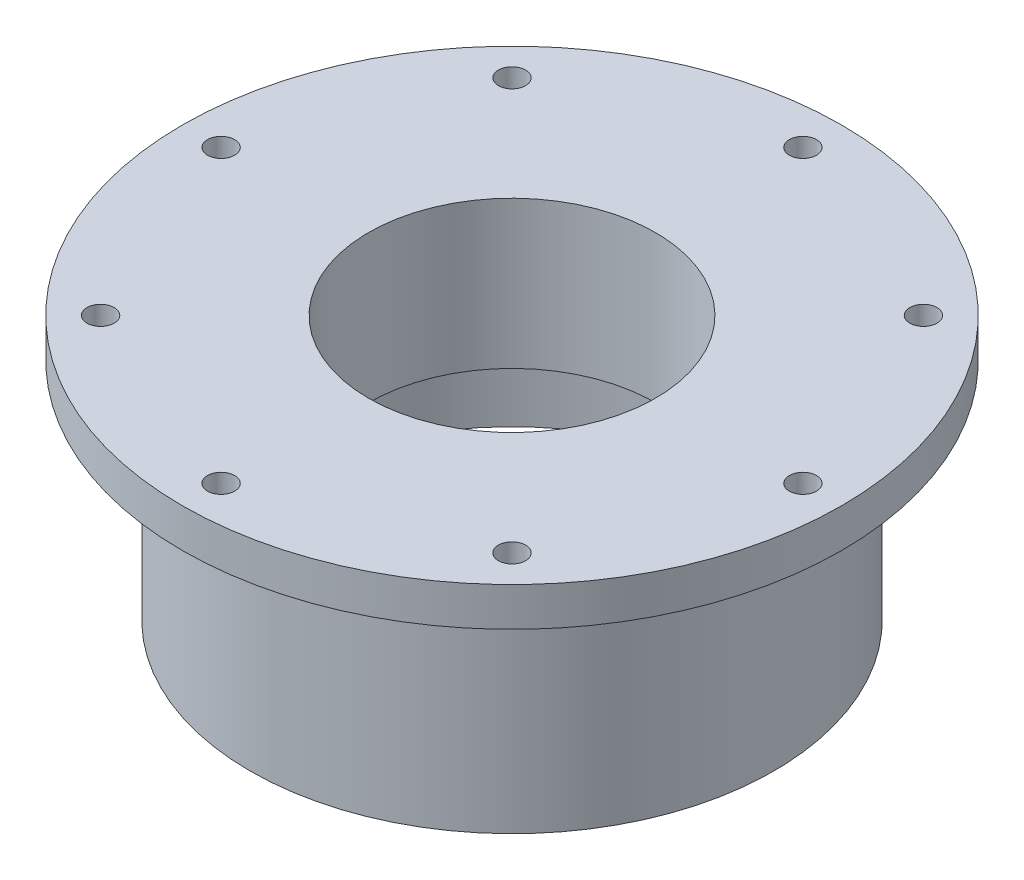
ISO-10303-21;
HEADER;
FILE_DESCRIPTION(('STEP AP214'),'2;1');
FILE_NAME('part.step','',(''),(''),'','','');
FILE_SCHEMA(('AUTOMOTIVE_DESIGN { 1 0 10303 214 1 1 1 1 }'));
ENDSEC;
DATA;
#1=APPLICATION_CONTEXT('core data for automotive mechanical design processes');
#2=APPLICATION_PROTOCOL_DEFINITION('international standard','automotive_design',2000,#1);
#3=PRODUCT_CONTEXT('',#1,'mechanical');
#4=PRODUCT('Part','Part','',(#3));
#5=PRODUCT_RELATED_PRODUCT_CATEGORY('part','',(#4));
#6=PRODUCT_DEFINITION_FORMATION('','',#4);
#7=PRODUCT_DEFINITION_CONTEXT('part definition',#1,'design');
#8=PRODUCT_DEFINITION('design','',#6,#7);
#9=PRODUCT_DEFINITION_SHAPE('','',#8);
#10=(LENGTH_UNIT() NAMED_UNIT(*) SI_UNIT(.MILLI.,.METRE.));
#11=(NAMED_UNIT(*) PLANE_ANGLE_UNIT() SI_UNIT($,.RADIAN.));
#12=(NAMED_UNIT(*) SI_UNIT($,.STERADIAN.) SOLID_ANGLE_UNIT());
#13=UNCERTAINTY_MEASURE_WITH_UNIT(LENGTH_MEASURE(1.E-05),#10,'distance_accuracy_value','');
#14=(GEOMETRIC_REPRESENTATION_CONTEXT(3) GLOBAL_UNCERTAINTY_ASSIGNED_CONTEXT((#13)) GLOBAL_UNIT_ASSIGNED_CONTEXT((#10,
#11,#12)) REPRESENTATION_CONTEXT('',''));
#15=CARTESIAN_POINT('',(0.,0.,0.));
#16=DIRECTION('',(0.,0.,1.));
#17=DIRECTION('',(1.,0.,0.));
#18=AXIS2_PLACEMENT_3D('',#15,#16,#17);
#19=CARTESIAN_POINT('',(0.,-16.5,0.));
#20=DIRECTION('',(0.,1.,0.));
#21=DIRECTION('',(0.,0.,1.));
#22=AXIS2_PLACEMENT_3D('',#19,#20,#21);
#23=PLANE('',#22);
#24=CARTESIAN_POINT('',(0.,-16.5,0.));
#25=DIRECTION('',(0.,1.,0.));
#26=DIRECTION('',(0.,0.,1.));
#27=AXIS2_PLACEMENT_3D('',#24,#25,#26);
#28=CIRCLE('',#27,18.5);
#29=CARTESIAN_POINT('',(0.,-16.5,18.5));
#30=VERTEX_POINT('',#29);
#31=EDGE_CURVE('E97',#30,#30,#28,.T.);
#32=ORIENTED_EDGE('',*,*,#31,.T.);
#33=EDGE_LOOP('',(#32));
#34=FACE_BOUND('',#33,.T.);
#35=CARTESIAN_POINT('',(0.,-16.5,0.));
#36=DIRECTION('',(0.,-1.,0.));
#37=DIRECTION('',(0.,0.,-1.));
#38=AXIS2_PLACEMENT_3D('',#35,#36,#37);
#39=CIRCLE('',#38,30.5);
#40=CARTESIAN_POINT('',(0.,-16.5,-30.5));
#41=VERTEX_POINT('',#40);
#42=EDGE_CURVE('E104',#41,#41,#39,.T.);
#43=ORIENTED_EDGE('',*,*,#42,.T.);
#44=EDGE_LOOP('',(#43));
#45=FACE_BOUND('',#44,.T.);
#46=ADVANCED_FACE('F31',(#34,#45),#23,.F.);
#47=CARTESIAN_POINT('',(0.,2.5,0.));
#48=DIRECTION('',(0.,1.,0.));
#49=DIRECTION('',(0.,0.,1.));
#50=AXIS2_PLACEMENT_3D('',#47,#48,#49);
#51=PLANE('',#50);
#52=CARTESIAN_POINT('',(-37.5,2.5,0.));
#53=DIRECTION('',(0.,1.,0.));
#54=DIRECTION('',(0.,0.,1.));
#55=AXIS2_PLACEMENT_3D('',#52,#53,#54);
#56=CIRCLE('',#55,1.75000000000037);
#57=CARTESIAN_POINT('',(-37.5,2.5,1.75000000000037));
#58=VERTEX_POINT('',#57);
#59=EDGE_CURVE('E80',#58,#58,#56,.T.);
#60=ORIENTED_EDGE('',*,*,#59,.F.);
#61=EDGE_LOOP('',(#60));
#62=FACE_BOUND('',#61,.T.);
#63=CARTESIAN_POINT('',(0.,2.5,37.5));
#64=DIRECTION('',(0.,1.,0.));
#65=DIRECTION('',(0.,0.,1.));
#66=AXIS2_PLACEMENT_3D('',#63,#64,#65);
#67=CIRCLE('',#66,1.75000000000025);
#68=CARTESIAN_POINT('',(0.,2.5,39.2500000000002));
#69=VERTEX_POINT('',#68);
#70=EDGE_CURVE('E68',#69,#69,#67,.T.);
#71=ORIENTED_EDGE('',*,*,#70,.F.);
#72=EDGE_LOOP('',(#71));
#73=FACE_BOUND('',#72,.T.);
#74=CARTESIAN_POINT('',(37.5,2.5,0.));
#75=DIRECTION('',(0.,1.,0.));
#76=DIRECTION('',(0.,0.,1.));
#77=AXIS2_PLACEMENT_3D('',#74,#75,#76);
#78=CIRCLE('',#77,1.75000000000013);
#79=CARTESIAN_POINT('',(37.5,2.5,1.75000000000013));
#80=VERTEX_POINT('',#79);
#81=EDGE_CURVE('E56',#80,#80,#78,.T.);
#82=ORIENTED_EDGE('',*,*,#81,.F.);
#83=EDGE_LOOP('',(#82));
#84=FACE_BOUND('',#83,.T.);
#85=CARTESIAN_POINT('',(0.,2.5,-37.5));
#86=DIRECTION('',(0.,1.,0.));
#87=DIRECTION('',(0.,0.,1.));
#88=AXIS2_PLACEMENT_3D('',#85,#86,#87);
#89=CIRCLE('',#88,1.75);
#90=CARTESIAN_POINT('',(0.,2.5,-35.75));
#91=VERTEX_POINT('',#90);
#92=EDGE_CURVE('E46',#91,#91,#89,.T.);
#93=ORIENTED_EDGE('',*,*,#92,.F.);
#94=EDGE_LOOP('',(#93));
#95=FACE_BOUND('',#94,.T.);
#96=CARTESIAN_POINT('',(0.,2.5,0.));
#97=DIRECTION('',(0.,1.,0.));
#98=DIRECTION('',(0.,0.,1.));
#99=AXIS2_PLACEMENT_3D('',#96,#97,#98);
#100=CIRCLE('',#99,42.5);
#101=CARTESIAN_POINT('',(0.,2.5,42.5));
#102=VERTEX_POINT('',#101);
#103=EDGE_CURVE('E10',#102,#102,#100,.T.);
#104=ORIENTED_EDGE('',*,*,#103,.T.);
#105=EDGE_LOOP('',(#104));
#106=FACE_BOUND('',#105,.T.);
#107=CARTESIAN_POINT('',(0.,2.5,0.));
#108=DIRECTION('',(0.,1.,0.));
#109=DIRECTION('',(0.,0.,1.));
#110=AXIS2_PLACEMENT_3D('',#107,#108,#109);
#111=CIRCLE('',#110,18.5);
#112=CARTESIAN_POINT('',(0.,2.5,18.5));
#113=VERTEX_POINT('',#112);
#114=EDGE_CURVE('E42',#113,#113,#111,.T.);
#115=ORIENTED_EDGE('',*,*,#114,.F.);
#116=EDGE_LOOP('',(#115));
#117=FACE_BOUND('',#116,.T.);
#118=CARTESIAN_POINT('',(26.5165042944955,2.5,-26.5165042944955));
#119=DIRECTION('',(0.,1.,0.));
#120=DIRECTION('',(0.,0.,1.));
#121=AXIS2_PLACEMENT_3D('',#118,#119,#120);
#122=CIRCLE('',#121,1.75000000000006);
#123=CARTESIAN_POINT('',(26.5165042944955,2.5,-24.7665042944955));
#124=VERTEX_POINT('',#123);
#125=EDGE_CURVE('E50',#124,#124,#122,.T.);
#126=ORIENTED_EDGE('',*,*,#125,.F.);
#127=EDGE_LOOP('',(#126));
#128=FACE_BOUND('',#127,.T.);
#129=CARTESIAN_POINT('',(26.5165042944955,2.5,26.5165042944955));
#130=DIRECTION('',(0.,1.,0.));
#131=DIRECTION('',(0.,0.,1.));
#132=AXIS2_PLACEMENT_3D('',#129,#130,#131);
#133=CIRCLE('',#132,1.7500000000002);
#134=CARTESIAN_POINT('',(26.5165042944955,2.5,28.2665042944957));
#135=VERTEX_POINT('',#134);
#136=EDGE_CURVE('E62',#135,#135,#133,.T.);
#137=ORIENTED_EDGE('',*,*,#136,.F.);
#138=EDGE_LOOP('',(#137));
#139=FACE_BOUND('',#138,.T.);
#140=CARTESIAN_POINT('',(-26.5165042944955,2.5,26.5165042944955));
#141=DIRECTION('',(0.,1.,0.));
#142=DIRECTION('',(0.,0.,1.));
#143=AXIS2_PLACEMENT_3D('',#140,#141,#142);
#144=CIRCLE('',#143,1.75000000000032);
#145=CARTESIAN_POINT('',(-26.5165042944955,2.5,28.2665042944958));
#146=VERTEX_POINT('',#145);
#147=EDGE_CURVE('E74',#146,#146,#144,.T.);
#148=ORIENTED_EDGE('',*,*,#147,.F.);
#149=EDGE_LOOP('',(#148));
#150=FACE_BOUND('',#149,.T.);
#151=CARTESIAN_POINT('',(-26.5165042944955,2.5,-26.5165042944955));
#152=DIRECTION('',(0.,1.,0.));
#153=DIRECTION('',(0.,0.,1.));
#154=AXIS2_PLACEMENT_3D('',#151,#152,#153);
#155=CIRCLE('',#154,1.75000000000044);
#156=CARTESIAN_POINT('',(-26.5165042944955,2.5,-24.7665042944951));
#157=VERTEX_POINT('',#156);
#158=EDGE_CURVE('E86',#157,#157,#155,.T.);
#159=ORIENTED_EDGE('',*,*,#158,.F.);
#160=EDGE_LOOP('',(#159));
#161=FACE_BOUND('',#160,.T.);
#162=ADVANCED_FACE('F128',(#62,#73,#84,#95,#106,#117,#128,#139,#150,#161),#51,.T.);
#163=CARTESIAN_POINT('',(0.,-2.5,0.));
#164=DIRECTION('',(0.,1.,0.));
#165=DIRECTION('',(0.,0.,1.));
#166=AXIS2_PLACEMENT_3D('',#163,#164,#165);
#167=PLANE('',#166);
#168=CARTESIAN_POINT('',(0.,-2.5,0.));
#169=DIRECTION('',(0.,1.,0.));
#170=DIRECTION('',(0.,0.,1.));
#171=AXIS2_PLACEMENT_3D('',#168,#169,#170);
#172=CIRCLE('',#171,33.75);
#173=CARTESIAN_POINT('',(0.,-2.5,33.75));
#174=VERTEX_POINT('',#173);
#175=EDGE_CURVE('E92',#174,#174,#172,.T.);
#176=ORIENTED_EDGE('',*,*,#175,.T.);
#177=EDGE_LOOP('',(#176));
#178=FACE_BOUND('',#177,.T.);
#179=CARTESIAN_POINT('',(0.,-2.5,0.));
#180=DIRECTION('',(0.,1.,0.));
#181=DIRECTION('',(0.,0.,1.));
#182=AXIS2_PLACEMENT_3D('',#179,#180,#181);
#183=CIRCLE('',#182,42.5);
#184=CARTESIAN_POINT('',(0.,-2.5,42.5));
#185=VERTEX_POINT('',#184);
#186=EDGE_CURVE('E35',#185,#185,#183,.T.);
#187=ORIENTED_EDGE('',*,*,#186,.F.);
#188=EDGE_LOOP('',(#187));
#189=FACE_BOUND('',#188,.T.);
#190=CARTESIAN_POINT('',(0.,-2.5,-37.5));
#191=DIRECTION('',(0.,1.,0.));
#192=DIRECTION('',(0.,0.,1.));
#193=AXIS2_PLACEMENT_3D('',#190,#191,#192);
#194=CIRCLE('',#193,1.75);
#195=CARTESIAN_POINT('',(0.,-2.5,-35.75));
#196=VERTEX_POINT('',#195);
#197=EDGE_CURVE('E47',#196,#196,#194,.T.);
#198=ORIENTED_EDGE('',*,*,#197,.T.);
#199=EDGE_LOOP('',(#198));
#200=FACE_BOUND('',#199,.T.);
#201=CARTESIAN_POINT('',(26.5165042944955,-2.5,-26.5165042944955));
#202=DIRECTION('',(0.,1.,0.));
#203=DIRECTION('',(0.,0.,1.));
#204=AXIS2_PLACEMENT_3D('',#201,#202,#203);
#205=CIRCLE('',#204,1.75000000000006);
#206=CARTESIAN_POINT('',(26.5165042944955,-2.5,-24.7665042944955));
#207=VERTEX_POINT('',#206);
#208=EDGE_CURVE('E53',#207,#207,#205,.T.);
#209=ORIENTED_EDGE('',*,*,#208,.T.);
#210=EDGE_LOOP('',(#209));
#211=FACE_BOUND('',#210,.T.);
#212=CARTESIAN_POINT('',(37.5,-2.5,0.));
#213=DIRECTION('',(0.,1.,0.));
#214=DIRECTION('',(0.,0.,1.));
#215=AXIS2_PLACEMENT_3D('',#212,#213,#214);
#216=CIRCLE('',#215,1.75000000000013);
#217=CARTESIAN_POINT('',(37.5,-2.5,1.75000000000013));
#218=VERTEX_POINT('',#217);
#219=EDGE_CURVE('E59',#218,#218,#216,.T.);
#220=ORIENTED_EDGE('',*,*,#219,.T.);
#221=EDGE_LOOP('',(#220));
#222=FACE_BOUND('',#221,.T.);
#223=CARTESIAN_POINT('',(26.5165042944955,-2.5,26.5165042944955));
#224=DIRECTION('',(0.,1.,0.));
#225=DIRECTION('',(0.,0.,1.));
#226=AXIS2_PLACEMENT_3D('',#223,#224,#225);
#227=CIRCLE('',#226,1.7500000000002);
#228=CARTESIAN_POINT('',(26.5165042944955,-2.5,28.2665042944957));
#229=VERTEX_POINT('',#228);
#230=EDGE_CURVE('E65',#229,#229,#227,.T.);
#231=ORIENTED_EDGE('',*,*,#230,.T.);
#232=EDGE_LOOP('',(#231));
#233=FACE_BOUND('',#232,.T.);
#234=CARTESIAN_POINT('',(0.,-2.5,37.5));
#235=DIRECTION('',(0.,1.,0.));
#236=DIRECTION('',(0.,0.,1.));
#237=AXIS2_PLACEMENT_3D('',#234,#235,#236);
#238=CIRCLE('',#237,1.75000000000025);
#239=CARTESIAN_POINT('',(0.,-2.5,39.2500000000002));
#240=VERTEX_POINT('',#239);
#241=EDGE_CURVE('E71',#240,#240,#238,.T.);
#242=ORIENTED_EDGE('',*,*,#241,.T.);
#243=EDGE_LOOP('',(#242));
#244=FACE_BOUND('',#243,.T.);
#245=CARTESIAN_POINT('',(-26.5165042944955,-2.5,26.5165042944955));
#246=DIRECTION('',(0.,1.,0.));
#247=DIRECTION('',(0.,0.,1.));
#248=AXIS2_PLACEMENT_3D('',#245,#246,#247);
#249=CIRCLE('',#248,1.75000000000032);
#250=CARTESIAN_POINT('',(-26.5165042944955,-2.5,28.2665042944958));
#251=VERTEX_POINT('',#250);
#252=EDGE_CURVE('E77',#251,#251,#249,.T.);
#253=ORIENTED_EDGE('',*,*,#252,.T.);
#254=EDGE_LOOP('',(#253));
#255=FACE_BOUND('',#254,.T.);
#256=CARTESIAN_POINT('',(-37.5,-2.5,0.));
#257=DIRECTION('',(0.,1.,0.));
#258=DIRECTION('',(0.,0.,1.));
#259=AXIS2_PLACEMENT_3D('',#256,#257,#258);
#260=CIRCLE('',#259,1.75000000000037);
#261=CARTESIAN_POINT('',(-37.5,-2.5,1.75000000000037));
#262=VERTEX_POINT('',#261);
#263=EDGE_CURVE('E83',#262,#262,#260,.T.);
#264=ORIENTED_EDGE('',*,*,#263,.T.);
#265=EDGE_LOOP('',(#264));
#266=FACE_BOUND('',#265,.T.);
#267=CARTESIAN_POINT('',(-26.5165042944955,-2.5,-26.5165042944955));
#268=DIRECTION('',(0.,1.,0.));
#269=DIRECTION('',(0.,0.,1.));
#270=AXIS2_PLACEMENT_3D('',#267,#268,#269);
#271=CIRCLE('',#270,1.75000000000044);
#272=CARTESIAN_POINT('',(-26.5165042944955,-2.5,-24.7665042944951));
#273=VERTEX_POINT('',#272);
#274=EDGE_CURVE('E89',#273,#273,#271,.T.);
#275=ORIENTED_EDGE('',*,*,#274,.T.);
#276=EDGE_LOOP('',(#275));
#277=FACE_BOUND('',#276,.T.);
#278=ADVANCED_FACE('F133',(#178,#189,#200,#211,#222,#233,#244,#255,#266,#277),#167,.F.);
#279=CARTESIAN_POINT('',(0.,2.5,0.));
#280=DIRECTION('',(0.,-1.,0.));
#281=DIRECTION('',(0.,0.,-1.));
#282=AXIS2_PLACEMENT_3D('',#279,#280,#281);
#283=CYLINDRICAL_SURFACE('',#282,42.5);
#284=ORIENTED_EDGE('',*,*,#103,.F.);
#285=EDGE_LOOP('',(#284));
#286=FACE_BOUND('',#285,.T.);
#287=ORIENTED_EDGE('',*,*,#186,.T.);
#288=EDGE_LOOP('',(#287));
#289=FACE_BOUND('',#288,.T.);
#290=ADVANCED_FACE('F33',(#286,#289),#283,.T.);
#291=CARTESIAN_POINT('',(0.,2.5,0.));
#292=DIRECTION('',(0.,-1.,0.));
#293=DIRECTION('',(0.,0.,-1.));
#294=AXIS2_PLACEMENT_3D('',#291,#292,#293);
#295=CYLINDRICAL_SURFACE('',#294,18.5);
#296=ORIENTED_EDGE('',*,*,#114,.T.);
#297=EDGE_LOOP('',(#296));
#298=FACE_BOUND('',#297,.T.);
#299=ORIENTED_EDGE('',*,*,#31,.F.);
#300=EDGE_LOOP('',(#299));
#301=FACE_BOUND('',#300,.T.);
#302=ADVANCED_FACE('F168',(#298,#301),#295,.F.);
#303=CARTESIAN_POINT('',(0.,2.5,-37.5));
#304=DIRECTION('',(0.,-1.,0.));
#305=DIRECTION('',(0.,0.,-1.));
#306=AXIS2_PLACEMENT_3D('',#303,#304,#305);
#307=CYLINDRICAL_SURFACE('',#306,1.75);
#308=ORIENTED_EDGE('',*,*,#92,.T.);
#309=EDGE_LOOP('',(#308));
#310=FACE_BOUND('',#309,.T.);
#311=ORIENTED_EDGE('',*,*,#197,.F.);
#312=EDGE_LOOP('',(#311));
#313=FACE_BOUND('',#312,.T.);
#314=ADVANCED_FACE('F164',(#310,#313),#307,.F.);
#315=CARTESIAN_POINT('',(26.5165042944955,2.5,-26.5165042944955));
#316=DIRECTION('',(0.,-1.,0.));
#317=DIRECTION('',(0.,0.,-1.));
#318=AXIS2_PLACEMENT_3D('',#315,#316,#317);
#319=CYLINDRICAL_SURFACE('',#318,1.75000000000006);
#320=ORIENTED_EDGE('',*,*,#125,.T.);
#321=EDGE_LOOP('',(#320));
#322=FACE_BOUND('',#321,.T.);
#323=ORIENTED_EDGE('',*,*,#208,.F.);
#324=EDGE_LOOP('',(#323));
#325=FACE_BOUND('',#324,.T.);
#326=ADVANCED_FACE('F160',(#322,#325),#319,.F.);
#327=CARTESIAN_POINT('',(37.5,2.5,0.));
#328=DIRECTION('',(0.,-1.,0.));
#329=DIRECTION('',(0.,0.,-1.));
#330=AXIS2_PLACEMENT_3D('',#327,#328,#329);
#331=CYLINDRICAL_SURFACE('',#330,1.75000000000013);
#332=ORIENTED_EDGE('',*,*,#81,.T.);
#333=EDGE_LOOP('',(#332));
#334=FACE_BOUND('',#333,.T.);
#335=ORIENTED_EDGE('',*,*,#219,.F.);
#336=EDGE_LOOP('',(#335));
#337=FACE_BOUND('',#336,.T.);
#338=ADVANCED_FACE('F156',(#334,#337),#331,.F.);
#339=CARTESIAN_POINT('',(26.5165042944955,2.5,26.5165042944955));
#340=DIRECTION('',(0.,-1.,0.));
#341=DIRECTION('',(0.,0.,-1.));
#342=AXIS2_PLACEMENT_3D('',#339,#340,#341);
#343=CYLINDRICAL_SURFACE('',#342,1.7500000000002);
#344=ORIENTED_EDGE('',*,*,#136,.T.);
#345=EDGE_LOOP('',(#344));
#346=FACE_BOUND('',#345,.T.);
#347=ORIENTED_EDGE('',*,*,#230,.F.);
#348=EDGE_LOOP('',(#347));
#349=FACE_BOUND('',#348,.T.);
#350=ADVANCED_FACE('F152',(#346,#349),#343,.F.);
#351=CARTESIAN_POINT('',(0.,2.5,37.5));
#352=DIRECTION('',(0.,-1.,0.));
#353=DIRECTION('',(0.,0.,-1.));
#354=AXIS2_PLACEMENT_3D('',#351,#352,#353);
#355=CYLINDRICAL_SURFACE('',#354,1.75000000000025);
#356=ORIENTED_EDGE('',*,*,#70,.T.);
#357=EDGE_LOOP('',(#356));
#358=FACE_BOUND('',#357,.T.);
#359=ORIENTED_EDGE('',*,*,#241,.F.);
#360=EDGE_LOOP('',(#359));
#361=FACE_BOUND('',#360,.T.);
#362=ADVANCED_FACE('F148',(#358,#361),#355,.F.);
#363=CARTESIAN_POINT('',(-26.5165042944955,2.5,26.5165042944955));
#364=DIRECTION('',(0.,-1.,0.));
#365=DIRECTION('',(0.,0.,-1.));
#366=AXIS2_PLACEMENT_3D('',#363,#364,#365);
#367=CYLINDRICAL_SURFACE('',#366,1.75000000000032);
#368=ORIENTED_EDGE('',*,*,#147,.T.);
#369=EDGE_LOOP('',(#368));
#370=FACE_BOUND('',#369,.T.);
#371=ORIENTED_EDGE('',*,*,#252,.F.);
#372=EDGE_LOOP('',(#371));
#373=FACE_BOUND('',#372,.T.);
#374=ADVANCED_FACE('F144',(#370,#373),#367,.F.);
#375=CARTESIAN_POINT('',(-37.5,2.5,0.));
#376=DIRECTION('',(0.,-1.,0.));
#377=DIRECTION('',(0.,0.,-1.));
#378=AXIS2_PLACEMENT_3D('',#375,#376,#377);
#379=CYLINDRICAL_SURFACE('',#378,1.75000000000037);
#380=ORIENTED_EDGE('',*,*,#59,.T.);
#381=EDGE_LOOP('',(#380));
#382=FACE_BOUND('',#381,.T.);
#383=ORIENTED_EDGE('',*,*,#263,.F.);
#384=EDGE_LOOP('',(#383));
#385=FACE_BOUND('',#384,.T.);
#386=ADVANCED_FACE('F140',(#382,#385),#379,.F.);
#387=CARTESIAN_POINT('',(-26.5165042944955,2.5,-26.5165042944955));
#388=DIRECTION('',(0.,-1.,0.));
#389=DIRECTION('',(0.,0.,-1.));
#390=AXIS2_PLACEMENT_3D('',#387,#388,#389);
#391=CYLINDRICAL_SURFACE('',#390,1.75000000000044);
#392=ORIENTED_EDGE('',*,*,#158,.T.);
#393=EDGE_LOOP('',(#392));
#394=FACE_BOUND('',#393,.T.);
#395=ORIENTED_EDGE('',*,*,#274,.F.);
#396=EDGE_LOOP('',(#395));
#397=FACE_BOUND('',#396,.T.);
#398=ADVANCED_FACE('F123',(#394,#397),#391,.F.);
#399=CARTESIAN_POINT('',(0.,-16.5,0.));
#400=DIRECTION('',(0.,1.,0.));
#401=DIRECTION('',(0.,0.,1.));
#402=AXIS2_PLACEMENT_3D('',#399,#400,#401);
#403=CYLINDRICAL_SURFACE('',#402,33.75);
#404=ORIENTED_EDGE('',*,*,#175,.F.);
#405=EDGE_LOOP('',(#404));
#406=FACE_BOUND('',#405,.T.);
#407=CARTESIAN_POINT('',(0.,-31.5,0.));
#408=DIRECTION('',(0.,-1.,0.));
#409=DIRECTION('',(0.,0.,-1.));
#410=AXIS2_PLACEMENT_3D('',#407,#408,#409);
#411=CIRCLE('',#410,33.75);
#412=CARTESIAN_POINT('',(0.,-31.5,-33.75));
#413=VERTEX_POINT('',#412);
#414=EDGE_CURVE('E100',#413,#413,#411,.T.);
#415=ORIENTED_EDGE('',*,*,#414,.F.);
#416=EDGE_LOOP('',(#415));
#417=FACE_BOUND('',#416,.T.);
#418=ADVANCED_FACE('F115',(#406,#417),#403,.T.);
#419=CARTESIAN_POINT('',(0.,-31.5,0.));
#420=DIRECTION('',(0.,-1.,0.));
#421=DIRECTION('',(0.,0.,-1.));
#422=AXIS2_PLACEMENT_3D('',#419,#420,#421);
#423=PLANE('',#422);
#424=ORIENTED_EDGE('',*,*,#414,.T.);
#425=EDGE_LOOP('',(#424));
#426=FACE_BOUND('',#425,.T.);
#427=CARTESIAN_POINT('',(0.,-31.5,0.));
#428=DIRECTION('',(0.,-1.,0.));
#429=DIRECTION('',(0.,0.,-1.));
#430=AXIS2_PLACEMENT_3D('',#427,#428,#429);
#431=CIRCLE('',#430,30.5);
#432=CARTESIAN_POINT('',(0.,-31.5,-30.5));
#433=VERTEX_POINT('',#432);
#434=EDGE_CURVE('E103',#433,#433,#431,.T.);
#435=ORIENTED_EDGE('',*,*,#434,.F.);
#436=EDGE_LOOP('',(#435));
#437=FACE_BOUND('',#436,.T.);
#438=ADVANCED_FACE('F113',(#426,#437),#423,.T.);
#439=CARTESIAN_POINT('',(0.,-31.5,0.));
#440=DIRECTION('',(0.,1.,0.));
#441=DIRECTION('',(0.,0.,1.));
#442=AXIS2_PLACEMENT_3D('',#439,#440,#441);
#443=CYLINDRICAL_SURFACE('',#442,30.5);
#444=ORIENTED_EDGE('',*,*,#434,.T.);
#445=EDGE_LOOP('',(#444));
#446=FACE_BOUND('',#445,.T.);
#447=ORIENTED_EDGE('',*,*,#42,.F.);
#448=EDGE_LOOP('',(#447));
#449=FACE_BOUND('',#448,.T.);
#450=ADVANCED_FACE('F110',(#446,#449),#443,.F.);
#451=CLOSED_SHELL('',(#46,#162,#278,#290,#302,#314,#326,#338,#350,#362,#374,#386,#398,#418,#438,#450));
#452=MANIFOLD_SOLID_BREP('B2',#451);
#453=ADVANCED_BREP_SHAPE_REPRESENTATION('',(#18,#452),#14);
#454=SHAPE_DEFINITION_REPRESENTATION(#9,#453);
ENDSEC;
END-ISO-10303-21;
